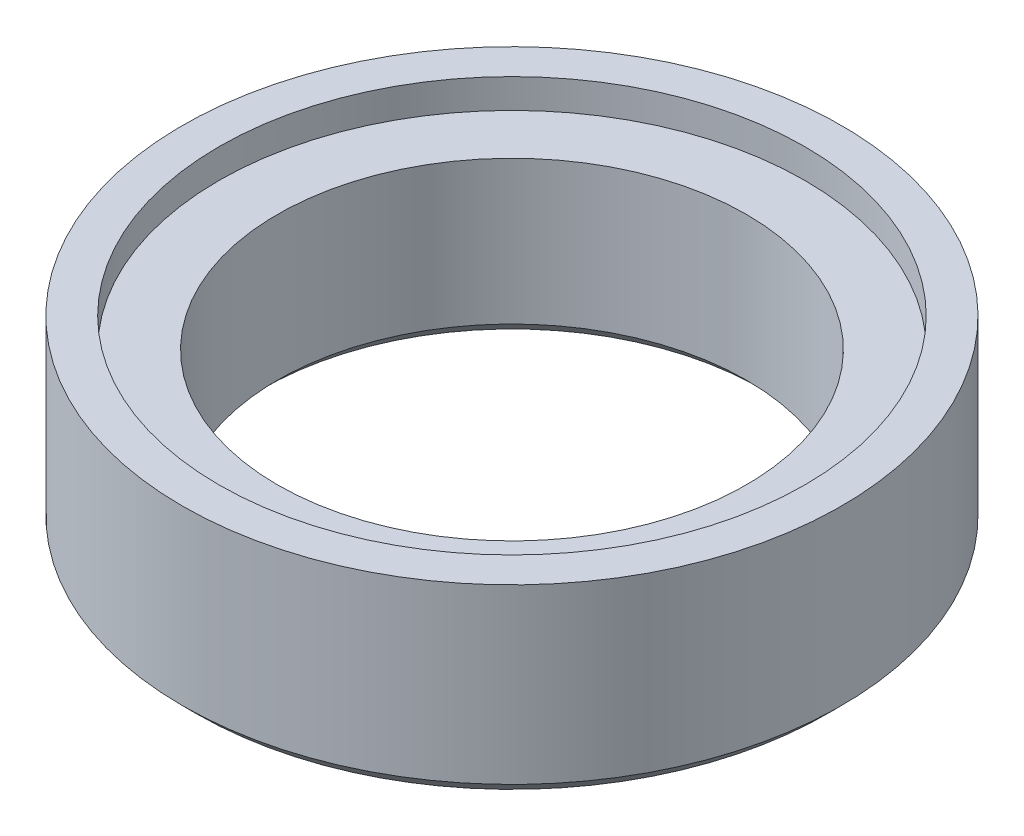
ISO-10303-21;
HEADER;
FILE_DESCRIPTION(('STEP AP214'),'2;1');
FILE_NAME('part.step','',(''),(''),'','','');
FILE_SCHEMA(('AUTOMOTIVE_DESIGN { 1 0 10303 214 1 1 1 1 }'));
ENDSEC;
DATA;
#1=APPLICATION_CONTEXT('core data for automotive mechanical design processes');
#2=APPLICATION_PROTOCOL_DEFINITION('international standard','automotive_design',2000,#1);
#3=PRODUCT_CONTEXT('',#1,'mechanical');
#4=PRODUCT('Part','Part','',(#3));
#5=PRODUCT_RELATED_PRODUCT_CATEGORY('part','',(#4));
#6=PRODUCT_DEFINITION_FORMATION('','',#4);
#7=PRODUCT_DEFINITION_CONTEXT('part definition',#1,'design');
#8=PRODUCT_DEFINITION('design','',#6,#7);
#9=PRODUCT_DEFINITION_SHAPE('','',#8);
#10=(LENGTH_UNIT() NAMED_UNIT(*) SI_UNIT(.MILLI.,.METRE.));
#11=(NAMED_UNIT(*) PLANE_ANGLE_UNIT() SI_UNIT($,.RADIAN.));
#12=(NAMED_UNIT(*) SI_UNIT($,.STERADIAN.) SOLID_ANGLE_UNIT());
#13=UNCERTAINTY_MEASURE_WITH_UNIT(LENGTH_MEASURE(1.E-05),#10,'distance_accuracy_value','');
#14=(GEOMETRIC_REPRESENTATION_CONTEXT(3) GLOBAL_UNCERTAINTY_ASSIGNED_CONTEXT((#13)) GLOBAL_UNIT_ASSIGNED_CONTEXT((#10,
#11,#12)) REPRESENTATION_CONTEXT('',''));
#15=CARTESIAN_POINT('',(0.,0.,0.));
#16=DIRECTION('',(0.,0.,1.));
#17=DIRECTION('',(1.,0.,0.));
#18=AXIS2_PLACEMENT_3D('',#15,#16,#17);
#19=CARTESIAN_POINT('',(0.,6.4,0.));
#20=DIRECTION('',(0.,-1.,0.));
#21=DIRECTION('',(0.,0.,-1.));
#22=AXIS2_PLACEMENT_3D('',#19,#20,#21);
#23=CYLINDRICAL_SURFACE('',#22,8.);
#24=CARTESIAN_POINT('',(0.,0.500000000000002,0.));
#25=DIRECTION('',(0.,1.,0.));
#26=DIRECTION('',(0.,0.,1.));
#27=AXIS2_PLACEMENT_3D('',#24,#25,#26);
#28=CIRCLE('',#27,8.);
#29=CARTESIAN_POINT('',(0.,0.500000000000002,8.));
#30=VERTEX_POINT('',#29);
#31=EDGE_CURVE('E48',#30,#30,#28,.F.);
#32=ORIENTED_EDGE('',*,*,#31,.T.);
#33=EDGE_LOOP('',(#32));
#34=FACE_BOUND('',#33,.T.);
#35=CARTESIAN_POINT('',(0.,5.4,0.));
#36=DIRECTION('',(0.,1.,0.));
#37=DIRECTION('',(0.,0.,1.));
#38=AXIS2_PLACEMENT_3D('',#35,#36,#37);
#39=CIRCLE('',#38,8.);
#40=CARTESIAN_POINT('',(0.,5.4,8.));
#41=VERTEX_POINT('',#40);
#42=EDGE_CURVE('E65',#41,#41,#39,.T.);
#43=ORIENTED_EDGE('',*,*,#42,.T.);
#44=EDGE_LOOP('',(#43));
#45=FACE_BOUND('',#44,.T.);
#46=ADVANCED_FACE('F39',(#34,#45),#23,.F.);
#47=CARTESIAN_POINT('',(0.,6.4,0.));
#48=DIRECTION('',(0.,1.,0.));
#49=DIRECTION('',(0.,0.,1.));
#50=AXIS2_PLACEMENT_3D('',#47,#48,#49);
#51=PLANE('',#50);
#52=CARTESIAN_POINT('',(0.,6.4,0.));
#53=DIRECTION('',(0.,1.,0.));
#54=DIRECTION('',(0.,0.,1.));
#55=AXIS2_PLACEMENT_3D('',#52,#53,#54);
#56=CIRCLE('',#55,10.);
#57=CARTESIAN_POINT('',(0.,6.4,10.));
#58=VERTEX_POINT('',#57);
#59=EDGE_CURVE('E73',#58,#58,#56,.T.);
#60=ORIENTED_EDGE('',*,*,#59,.F.);
#61=EDGE_LOOP('',(#60));
#62=FACE_BOUND('',#61,.T.);
#63=CARTESIAN_POINT('',(0.,6.4,0.));
#64=DIRECTION('',(0.,1.,0.));
#65=DIRECTION('',(0.,0.,1.));
#66=AXIS2_PLACEMENT_3D('',#63,#64,#65);
#67=CIRCLE('',#66,11.25);
#68=CARTESIAN_POINT('',(0.,6.4,11.25));
#69=VERTEX_POINT('',#68);
#70=EDGE_CURVE('E64',#69,#69,#67,.T.);
#71=ORIENTED_EDGE('',*,*,#70,.T.);
#72=EDGE_LOOP('',(#71));
#73=FACE_BOUND('',#72,.T.);
#74=ADVANCED_FACE('F90',(#62,#73),#51,.T.);
#75=CARTESIAN_POINT('',(0.,0.,0.));
#76=DIRECTION('',(0.,1.,0.));
#77=DIRECTION('',(0.,0.,1.));
#78=AXIS2_PLACEMENT_3D('',#75,#76,#77);
#79=PLANE('',#78);
#80=CARTESIAN_POINT('',(0.,0.,0.));
#81=DIRECTION('',(0.,1.,0.));
#82=DIRECTION('',(0.,0.,1.));
#83=AXIS2_PLACEMENT_3D('',#80,#81,#82);
#84=CIRCLE('',#83,8.5);
#85=CARTESIAN_POINT('',(0.,0.,8.5));
#86=VERTEX_POINT('',#85);
#87=EDGE_CURVE('E53',#86,#86,#84,.T.);
#88=ORIENTED_EDGE('',*,*,#87,.T.);
#89=EDGE_LOOP('',(#88));
#90=FACE_BOUND('',#89,.T.);
#91=CARTESIAN_POINT('',(0.,0.,0.));
#92=DIRECTION('',(0.,1.,0.));
#93=DIRECTION('',(0.,0.,1.));
#94=AXIS2_PLACEMENT_3D('',#91,#92,#93);
#95=CIRCLE('',#94,10.75);
#96=CARTESIAN_POINT('',(0.,0.,10.75));
#97=VERTEX_POINT('',#96);
#98=EDGE_CURVE('E58',#97,#97,#95,.F.);
#99=ORIENTED_EDGE('',*,*,#98,.T.);
#100=EDGE_LOOP('',(#99));
#101=FACE_BOUND('',#100,.T.);
#102=ADVANCED_FACE('F93',(#90,#101),#79,.F.);
#103=CARTESIAN_POINT('',(0.,6.4,0.));
#104=DIRECTION('',(0.,-1.,0.));
#105=DIRECTION('',(0.,0.,-1.));
#106=AXIS2_PLACEMENT_3D('',#103,#104,#105);
#107=CYLINDRICAL_SURFACE('',#106,11.25);
#108=CARTESIAN_POINT('',(0.,0.499999999999999,0.));
#109=DIRECTION('',(0.,1.,0.));
#110=DIRECTION('',(0.,0.,1.));
#111=AXIS2_PLACEMENT_3D('',#108,#109,#110);
#112=CIRCLE('',#111,11.25);
#113=CARTESIAN_POINT('',(0.,0.499999999999999,11.25));
#114=VERTEX_POINT('',#113);
#115=EDGE_CURVE('E10',#114,#114,#112,.T.);
#116=ORIENTED_EDGE('',*,*,#115,.T.);
#117=EDGE_LOOP('',(#116));
#118=FACE_BOUND('',#117,.T.);
#119=ORIENTED_EDGE('',*,*,#70,.F.);
#120=EDGE_LOOP('',(#119));
#121=FACE_BOUND('',#120,.T.);
#122=ADVANCED_FACE('F86',(#118,#121),#107,.T.);
#123=CARTESIAN_POINT('',(0.,5.4,0.));
#124=DIRECTION('',(0.,1.,0.));
#125=DIRECTION('',(0.,0.,1.));
#126=AXIS2_PLACEMENT_3D('',#123,#124,#125);
#127=CYLINDRICAL_SURFACE('',#126,10.);
#128=CARTESIAN_POINT('',(0.,5.4,0.));
#129=DIRECTION('',(0.,1.,0.));
#130=DIRECTION('',(0.,0.,1.));
#131=AXIS2_PLACEMENT_3D('',#128,#129,#130);
#132=CIRCLE('',#131,10.);
#133=CARTESIAN_POINT('',(0.,5.4,10.));
#134=VERTEX_POINT('',#133);
#135=EDGE_CURVE('E69',#134,#134,#132,.T.);
#136=ORIENTED_EDGE('',*,*,#135,.F.);
#137=EDGE_LOOP('',(#136));
#138=FACE_BOUND('',#137,.T.);
#139=ORIENTED_EDGE('',*,*,#59,.T.);
#140=EDGE_LOOP('',(#139));
#141=FACE_BOUND('',#140,.T.);
#142=ADVANCED_FACE('F83',(#138,#141),#127,.F.);
#143=CARTESIAN_POINT('',(0.,5.4,0.));
#144=DIRECTION('',(0.,1.,0.));
#145=DIRECTION('',(0.,0.,1.));
#146=AXIS2_PLACEMENT_3D('',#143,#144,#145);
#147=PLANE('',#146);
#148=ORIENTED_EDGE('',*,*,#42,.F.);
#149=EDGE_LOOP('',(#148));
#150=FACE_BOUND('',#149,.T.);
#151=ORIENTED_EDGE('',*,*,#135,.T.);
#152=EDGE_LOOP('',(#151));
#153=FACE_BOUND('',#152,.T.);
#154=ADVANCED_FACE('F81',(#150,#153),#147,.T.);
#155=CARTESIAN_POINT('',(0.,0.,0.));
#156=DIRECTION('',(0.,-1.,0.));
#157=DIRECTION('',(0.,0.,-1.));
#158=AXIS2_PLACEMENT_3D('',#155,#156,#157);
#159=CONICAL_SURFACE('',#158,8.5,0.785398163397448);
#160=ORIENTED_EDGE('',*,*,#31,.F.);
#161=EDGE_LOOP('',(#160));
#162=FACE_BOUND('',#161,.T.);
#163=ORIENTED_EDGE('',*,*,#87,.F.);
#164=EDGE_LOOP('',(#163));
#165=FACE_BOUND('',#164,.T.);
#166=ADVANCED_FACE('F111',(#162,#165),#159,.F.);
#167=CARTESIAN_POINT('',(0.,0.499999999999999,0.));
#168=DIRECTION('',(0.,1.,0.));
#169=DIRECTION('',(0.,0.,1.));
#170=AXIS2_PLACEMENT_3D('',#167,#168,#169);
#171=CONICAL_SURFACE('',#170,11.25,0.785398163397452);
#172=ORIENTED_EDGE('',*,*,#98,.F.);
#173=EDGE_LOOP('',(#172));
#174=FACE_BOUND('',#173,.T.);
#175=ORIENTED_EDGE('',*,*,#115,.F.);
#176=EDGE_LOOP('',(#175));
#177=FACE_BOUND('',#176,.T.);
#178=ADVANCED_FACE('F42',(#174,#177),#171,.T.);
#179=CLOSED_SHELL('',(#46,#74,#102,#122,#142,#154,#166,#178));
#180=MANIFOLD_SOLID_BREP('B2',#179);
#181=ADVANCED_BREP_SHAPE_REPRESENTATION('',(#18,#180),#14);
#182=SHAPE_DEFINITION_REPRESENTATION(#9,#181);
ENDSEC;
END-ISO-10303-21;
